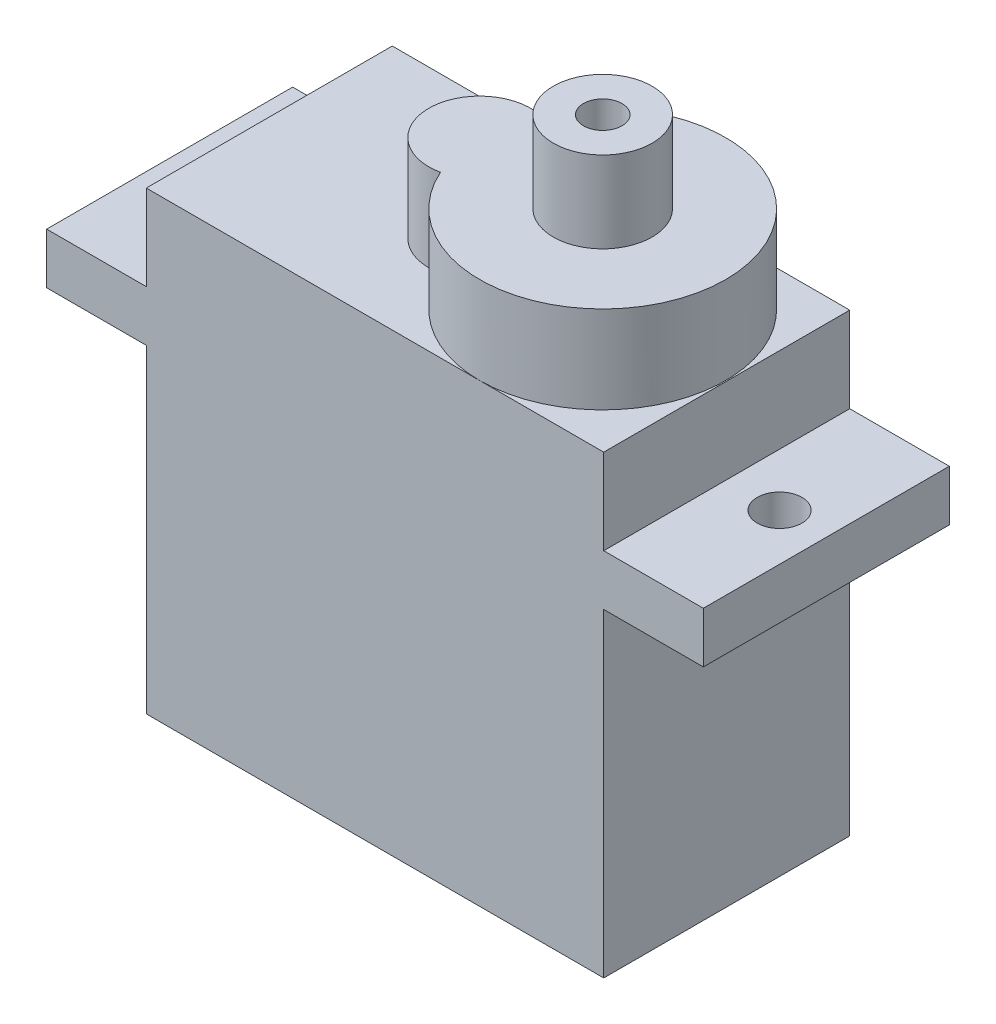
ISO-10303-21;
HEADER;
FILE_DESCRIPTION(('STEP AP214'),'2;1');
FILE_NAME('part.step','',(''),(''),'','','');
FILE_SCHEMA(('AUTOMOTIVE_DESIGN { 1 0 10303 214 1 1 1 1 }'));
ENDSEC;
DATA;
#1=APPLICATION_CONTEXT('core data for automotive mechanical design processes');
#2=APPLICATION_PROTOCOL_DEFINITION('international standard','automotive_design',2000,#1);
#3=PRODUCT_CONTEXT('',#1,'mechanical');
#4=PRODUCT('Part','Part','',(#3));
#5=PRODUCT_RELATED_PRODUCT_CATEGORY('part','',(#4));
#6=PRODUCT_DEFINITION_FORMATION('','',#4);
#7=PRODUCT_DEFINITION_CONTEXT('part definition',#1,'design');
#8=PRODUCT_DEFINITION('design','',#6,#7);
#9=PRODUCT_DEFINITION_SHAPE('','',#8);
#10=(LENGTH_UNIT() NAMED_UNIT(*) SI_UNIT(.MILLI.,.METRE.));
#11=(NAMED_UNIT(*) PLANE_ANGLE_UNIT() SI_UNIT($,.RADIAN.));
#12=(NAMED_UNIT(*) SI_UNIT($,.STERADIAN.) SOLID_ANGLE_UNIT());
#13=UNCERTAINTY_MEASURE_WITH_UNIT(LENGTH_MEASURE(1.E-05),#10,'distance_accuracy_value','');
#14=(GEOMETRIC_REPRESENTATION_CONTEXT(3) GLOBAL_UNCERTAINTY_ASSIGNED_CONTEXT((#13)) GLOBAL_UNIT_ASSIGNED_CONTEXT((#10,
#11,#12)) REPRESENTATION_CONTEXT('',''));
#15=CARTESIAN_POINT('',(0.,0.,0.));
#16=DIRECTION('',(0.,0.,1.));
#17=DIRECTION('',(1.,0.,0.));
#18=AXIS2_PLACEMENT_3D('',#15,#16,#17);
#19=CARTESIAN_POINT('',(2.125,26.7,0.));
#20=DIRECTION('',(0.,1.,0.));
#21=DIRECTION('',(0.,0.,1.));
#22=AXIS2_PLACEMENT_3D('',#19,#20,#21);
#23=PLANE('',#22);
#24=CARTESIAN_POINT('',(-0.900000000000001,26.7,0.));
#25=DIRECTION('',(0.,1.,0.));
#26=DIRECTION('',(0.,0.,1.));
#27=AXIS2_PLACEMENT_3D('',#24,#25,#26);
#28=CIRCLE('',#27,2.5);
#29=CARTESIAN_POINT('',(-0.383471074380167,26.7,-2.44605761767748));
#30=VERTEX_POINT('',#29);
#31=CARTESIAN_POINT('',(-0.383471074380168,26.7,2.44605761767748));
#32=VERTEX_POINT('',#31);
#33=EDGE_CURVE('E149',#30,#32,#28,.T.);
#34=ORIENTED_EDGE('',*,*,#33,.T.);
#35=CARTESIAN_POINT('',(5.15,26.7,0.));
#36=DIRECTION('',(0.,1.,0.));
#37=DIRECTION('',(0.,0.,1.));
#38=AXIS2_PLACEMENT_3D('',#35,#36,#37);
#39=CIRCLE('',#38,6.05);
#40=EDGE_CURVE('E139',#32,#30,#39,.T.);
#41=ORIENTED_EDGE('',*,*,#40,.T.);
#42=EDGE_LOOP('',(#34,#41));
#43=FACE_BOUND('',#42,.T.);
#44=CARTESIAN_POINT('',(5.15,26.7,0.));
#45=DIRECTION('',(0.,1.,0.));
#46=DIRECTION('',(0.,0.,1.));
#47=AXIS2_PLACEMENT_3D('',#44,#45,#46);
#48=CIRCLE('',#47,2.43);
#49=CARTESIAN_POINT('',(5.15,26.7,2.43));
#50=VERTEX_POINT('',#49);
#51=EDGE_CURVE('E396',#50,#50,#48,.T.);
#52=ORIENTED_EDGE('',*,*,#51,.F.);
#53=EDGE_LOOP('',(#52));
#54=FACE_BOUND('',#53,.T.);
#55=ADVANCED_FACE('F33',(#43,#54),#23,.T.);
#56=CARTESIAN_POINT('',(0.,22.4,0.));
#57=DIRECTION('',(0.,1.,0.));
#58=DIRECTION('',(0.,0.,1.));
#59=AXIS2_PLACEMENT_3D('',#56,#57,#58);
#60=PLANE('',#59);
#61=CARTESIAN_POINT('',(-0.900000000000001,22.4,0.));
#62=DIRECTION('',(0.,1.,0.));
#63=DIRECTION('',(0.,0.,1.));
#64=AXIS2_PLACEMENT_3D('',#61,#62,#63);
#65=CIRCLE('',#64,2.5);
#66=CARTESIAN_POINT('',(-0.383471074380167,22.4,-2.44605761767748));
#67=VERTEX_POINT('',#66);
#68=CARTESIAN_POINT('',(-0.383471074380168,22.4,2.44605761767748));
#69=VERTEX_POINT('',#68);
#70=EDGE_CURVE('E155',#67,#69,#65,.T.);
#71=ORIENTED_EDGE('',*,*,#70,.F.);
#72=CARTESIAN_POINT('',(5.15,22.4,0.));
#73=DIRECTION('',(0.,1.,0.));
#74=DIRECTION('',(0.,0.,1.));
#75=AXIS2_PLACEMENT_3D('',#72,#73,#74);
#76=CIRCLE('',#75,6.05);
#77=CARTESIAN_POINT('',(5.15,22.4,-6.05));
#78=VERTEX_POINT('',#77);
#79=EDGE_CURVE('E54',#78,#67,#76,.T.);
#80=ORIENTED_EDGE('',*,*,#79,.F.);
#81=DIRECTION('',(-1.,0.,0.));
#82=VECTOR('',#81,1.);
#83=CARTESIAN_POINT('',(11.25,22.4,-6.05));
#84=LINE('',#83,#82);
#85=CARTESIAN_POINT('',(-11.25,22.4,-6.05));
#86=VERTEX_POINT('',#85);
#87=EDGE_CURVE('E169',#78,#86,#84,.T.);
#88=ORIENTED_EDGE('',*,*,#87,.T.);
#89=DIRECTION('',(0.,0.,1.));
#90=VECTOR('',#89,1.);
#91=CARTESIAN_POINT('',(-11.25,22.4,-6.05));
#92=LINE('',#91,#90);
#93=CARTESIAN_POINT('',(-11.25,22.4,6.05));
#94=VERTEX_POINT('',#93);
#95=EDGE_CURVE('E173',#86,#94,#92,.T.);
#96=ORIENTED_EDGE('',*,*,#95,.T.);
#97=DIRECTION('',(1.,0.,0.));
#98=VECTOR('',#97,1.);
#99=CARTESIAN_POINT('',(-11.25,22.4,6.05));
#100=LINE('',#99,#98);
#101=CARTESIAN_POINT('',(5.15,22.4,6.05));
#102=VERTEX_POINT('',#101);
#103=EDGE_CURVE('E164',#94,#102,#100,.T.);
#104=ORIENTED_EDGE('',*,*,#103,.T.);
#105=EDGE_CURVE('E48',#69,#102,#76,.T.);
#106=ORIENTED_EDGE('',*,*,#105,.F.);
#107=EDGE_LOOP('',(#71,#80,#88,#96,#104,#106));
#108=FACE_BOUND('',#107,.T.);
#109=ADVANCED_FACE('F357',(#108),#60,.T.);
#110=CARTESIAN_POINT('',(0.,18.2,0.));
#111=DIRECTION('',(0.,1.,0.));
#112=DIRECTION('',(0.,0.,1.));
#113=AXIS2_PLACEMENT_3D('',#110,#111,#112);
#114=PLANE('',#113);
#115=DIRECTION('',(0.,0.,1.));
#116=VECTOR('',#115,1.);
#117=CARTESIAN_POINT('',(-11.25,18.2,-6.05));
#118=LINE('',#117,#116);
#119=CARTESIAN_POINT('',(-11.25,18.2,-6.05));
#120=VERTEX_POINT('',#119);
#121=CARTESIAN_POINT('',(-11.25,18.2,6.05));
#122=VERTEX_POINT('',#121);
#123=EDGE_CURVE('E159',#120,#122,#118,.T.);
#124=ORIENTED_EDGE('',*,*,#123,.F.);
#125=DIRECTION('',(-1.,0.,0.));
#126=VECTOR('',#125,1.);
#127=CARTESIAN_POINT('',(16.15,18.2,-6.05));
#128=LINE('',#127,#126);
#129=CARTESIAN_POINT('',(-16.15,18.2,-6.05));
#130=VERTEX_POINT('',#129);
#131=EDGE_CURVE('E182',#120,#130,#128,.T.);
#132=ORIENTED_EDGE('',*,*,#131,.T.);
#133=DIRECTION('',(0.,0.,1.));
#134=VECTOR('',#133,1.);
#135=CARTESIAN_POINT('',(-16.15,18.2,6.05));
#136=LINE('',#135,#134);
#137=CARTESIAN_POINT('',(-16.15,18.2,6.05));
#138=VERTEX_POINT('',#137);
#139=EDGE_CURVE('E238',#130,#138,#136,.T.);
#140=ORIENTED_EDGE('',*,*,#139,.T.);
#141=DIRECTION('',(1.,0.,0.));
#142=VECTOR('',#141,1.);
#143=CARTESIAN_POINT('',(16.15,18.2,6.05));
#144=LINE('',#143,#142);
#145=EDGE_CURVE('E222',#138,#122,#144,.T.);
#146=ORIENTED_EDGE('',*,*,#145,.T.);
#147=EDGE_LOOP('',(#124,#132,#140,#146));
#148=FACE_BOUND('',#147,.T.);
#149=CARTESIAN_POINT('',(-13.85,18.2,0.));
#150=DIRECTION('',(0.,1.,0.));
#151=DIRECTION('',(0.,0.,1.));
#152=AXIS2_PLACEMENT_3D('',#149,#150,#151);
#153=CIRCLE('',#152,1.1);
#154=CARTESIAN_POINT('',(-13.85,18.2,1.1));
#155=VERTEX_POINT('',#154);
#156=EDGE_CURVE('E330',#155,#155,#153,.T.);
#157=ORIENTED_EDGE('',*,*,#156,.F.);
#158=EDGE_LOOP('',(#157));
#159=FACE_BOUND('',#158,.T.);
#160=ADVANCED_FACE('F341',(#148,#159),#114,.T.);
#161=CARTESIAN_POINT('',(-11.25,15.7,6.05));
#162=DIRECTION('',(1.,0.,0.));
#163=DIRECTION('',(0.,0.,-1.));
#164=AXIS2_PLACEMENT_3D('',#161,#162,#163);
#165=PLANE('',#164);
#166=DIRECTION('',(0.,0.,1.));
#167=VECTOR('',#166,1.);
#168=CARTESIAN_POINT('',(-11.25,0.,6.05));
#169=LINE('',#168,#167);
#170=CARTESIAN_POINT('',(-11.25,0.,-6.05));
#171=VERTEX_POINT('',#170);
#172=CARTESIAN_POINT('',(-11.25,0.,6.05));
#173=VERTEX_POINT('',#172);
#174=EDGE_CURVE('E267',#171,#173,#169,.T.);
#175=ORIENTED_EDGE('',*,*,#174,.T.);
#176=DIRECTION('',(0.,-1.,0.));
#177=VECTOR('',#176,1.);
#178=CARTESIAN_POINT('',(-11.25,15.7,6.05));
#179=LINE('',#178,#177);
#180=CARTESIAN_POINT('',(-11.25,15.7,6.05));
#181=VERTEX_POINT('',#180);
#182=EDGE_CURVE('E249',#181,#173,#179,.T.);
#183=ORIENTED_EDGE('',*,*,#182,.F.);
#184=DIRECTION('',(0.,0.,1.));
#185=VECTOR('',#184,1.);
#186=CARTESIAN_POINT('',(-11.25,15.7,6.05));
#187=LINE('',#186,#185);
#188=CARTESIAN_POINT('',(-11.25,15.7,-6.05));
#189=VERTEX_POINT('',#188);
#190=EDGE_CURVE('E253',#189,#181,#187,.T.);
#191=ORIENTED_EDGE('',*,*,#190,.F.);
#192=DIRECTION('',(0.,-1.,0.));
#193=VECTOR('',#192,1.);
#194=CARTESIAN_POINT('',(-11.25,15.7,-6.05));
#195=LINE('',#194,#193);
#196=EDGE_CURVE('E242',#189,#171,#195,.T.);
#197=ORIENTED_EDGE('',*,*,#196,.T.);
#198=EDGE_LOOP('',(#175,#183,#191,#197));
#199=FACE_BOUND('',#198,.T.);
#200=ADVANCED_FACE('F35',(#199),#165,.F.);
#201=CARTESIAN_POINT('',(11.25,15.7,6.05));
#202=DIRECTION('',(0.,0.,-1.));
#203=DIRECTION('',(-1.,0.,0.));
#204=AXIS2_PLACEMENT_3D('',#201,#202,#203);
#205=PLANE('',#204);
#206=DIRECTION('',(1.,0.,0.));
#207=VECTOR('',#206,1.);
#208=CARTESIAN_POINT('',(11.25,0.,6.05));
#209=LINE('',#208,#207);
#210=CARTESIAN_POINT('',(11.25,0.,6.05));
#211=VERTEX_POINT('',#210);
#212=EDGE_CURVE('E284',#173,#211,#209,.T.);
#213=ORIENTED_EDGE('',*,*,#212,.T.);
#214=DIRECTION('',(0.,-1.,0.));
#215=VECTOR('',#214,1.);
#216=CARTESIAN_POINT('',(11.25,15.7,6.05));
#217=LINE('',#216,#215);
#218=CARTESIAN_POINT('',(11.25,15.7,6.05));
#219=VERTEX_POINT('',#218);
#220=EDGE_CURVE('E252',#219,#211,#217,.T.);
#221=ORIENTED_EDGE('',*,*,#220,.F.);
#222=DIRECTION('',(1.,0.,0.));
#223=VECTOR('',#222,1.);
#224=CARTESIAN_POINT('',(16.15,15.7,6.05));
#225=LINE('',#224,#223);
#226=CARTESIAN_POINT('',(16.15,15.7,6.05));
#227=VERTEX_POINT('',#226);
#228=EDGE_CURVE('E263',#219,#227,#225,.T.);
#229=ORIENTED_EDGE('',*,*,#228,.T.);
#230=DIRECTION('',(0.,-1.,0.));
#231=VECTOR('',#230,1.);
#232=CARTESIAN_POINT('',(16.15,18.2,6.05));
#233=LINE('',#232,#231);
#234=CARTESIAN_POINT('',(16.15,18.2,6.05));
#235=VERTEX_POINT('',#234);
#236=EDGE_CURVE('E291',#235,#227,#233,.T.);
#237=ORIENTED_EDGE('',*,*,#236,.F.);
#238=CARTESIAN_POINT('',(11.25,18.2,6.05));
#239=VERTEX_POINT('',#238);
#240=EDGE_CURVE('E227',#239,#235,#144,.T.);
#241=ORIENTED_EDGE('',*,*,#240,.F.);
#242=DIRECTION('',(0.,-1.,0.));
#243=VECTOR('',#242,1.);
#244=CARTESIAN_POINT('',(11.25,22.4,6.05));
#245=LINE('',#244,#243);
#246=CARTESIAN_POINT('',(11.25,22.4,6.05));
#247=VERTEX_POINT('',#246);
#248=EDGE_CURVE('E188',#247,#239,#245,.T.);
#249=ORIENTED_EDGE('',*,*,#248,.F.);
#250=EDGE_CURVE('E167',#102,#247,#100,.T.);
#251=ORIENTED_EDGE('',*,*,#250,.F.);
#252=ORIENTED_EDGE('',*,*,#103,.F.);
#253=DIRECTION('',(0.,-1.,0.));
#254=VECTOR('',#253,1.);
#255=CARTESIAN_POINT('',(-11.25,22.4,6.05));
#256=LINE('',#255,#254);
#257=EDGE_CURVE('E175',#94,#122,#256,.T.);
#258=ORIENTED_EDGE('',*,*,#257,.T.);
#259=ORIENTED_EDGE('',*,*,#145,.F.);
#260=DIRECTION('',(0.,-1.,0.));
#261=VECTOR('',#260,1.);
#262=CARTESIAN_POINT('',(-16.15,18.2,6.05));
#263=LINE('',#262,#261);
#264=CARTESIAN_POINT('',(-16.15,15.7,6.05));
#265=VERTEX_POINT('',#264);
#266=EDGE_CURVE('E287',#138,#265,#263,.T.);
#267=ORIENTED_EDGE('',*,*,#266,.T.);
#268=EDGE_CURVE('E326',#265,#181,#225,.T.);
#269=ORIENTED_EDGE('',*,*,#268,.T.);
#270=ORIENTED_EDGE('',*,*,#182,.T.);
#271=EDGE_LOOP('',(#213,#221,#229,#237,#241,#249,#251,#252,#258,#259,#267,#269,#270));
#272=FACE_BOUND('',#271,.T.);
#273=ADVANCED_FACE('F408',(#272),#205,.F.);
#274=CARTESIAN_POINT('',(11.25,15.7,6.05));
#275=DIRECTION('',(-1.,0.,0.));
#276=DIRECTION('',(0.,0.,1.));
#277=AXIS2_PLACEMENT_3D('',#274,#275,#276);
#278=PLANE('',#277);
#279=DIRECTION('',(0.,0.,-1.));
#280=VECTOR('',#279,1.);
#281=CARTESIAN_POINT('',(11.25,0.,6.05));
#282=LINE('',#281,#280);
#283=CARTESIAN_POINT('',(11.25,0.,-6.05));
#284=VERTEX_POINT('',#283);
#285=EDGE_CURVE('E283',#211,#284,#282,.T.);
#286=ORIENTED_EDGE('',*,*,#285,.T.);
#287=DIRECTION('',(0.,-1.,0.));
#288=VECTOR('',#287,1.);
#289=CARTESIAN_POINT('',(11.25,15.7,-6.05));
#290=LINE('',#289,#288);
#291=CARTESIAN_POINT('',(11.25,15.7,-6.05));
#292=VERTEX_POINT('',#291);
#293=EDGE_CURVE('E245',#292,#284,#290,.T.);
#294=ORIENTED_EDGE('',*,*,#293,.F.);
#295=DIRECTION('',(0.,0.,-1.));
#296=VECTOR('',#295,1.);
#297=CARTESIAN_POINT('',(11.25,15.7,6.05));
#298=LINE('',#297,#296);
#299=EDGE_CURVE('E246',#219,#292,#298,.T.);
#300=ORIENTED_EDGE('',*,*,#299,.F.);
#301=ORIENTED_EDGE('',*,*,#220,.T.);
#302=EDGE_LOOP('',(#286,#294,#300,#301));
#303=FACE_BOUND('',#302,.T.);
#304=ADVANCED_FACE('F318',(#303),#278,.F.);
#305=CARTESIAN_POINT('',(11.25,15.7,-6.05));
#306=DIRECTION('',(0.,0.,1.));
#307=DIRECTION('',(1.,0.,0.));
#308=AXIS2_PLACEMENT_3D('',#305,#306,#307);
#309=PLANE('',#308);
#310=DIRECTION('',(-1.,0.,0.));
#311=VECTOR('',#310,1.);
#312=CARTESIAN_POINT('',(11.25,0.,-6.05));
#313=LINE('',#312,#311);
#314=EDGE_CURVE('E257',#284,#171,#313,.T.);
#315=ORIENTED_EDGE('',*,*,#314,.T.);
#316=ORIENTED_EDGE('',*,*,#196,.F.);
#317=DIRECTION('',(-1.,0.,0.));
#318=VECTOR('',#317,1.);
#319=CARTESIAN_POINT('',(16.15,15.7,-6.05));
#320=LINE('',#319,#318);
#321=CARTESIAN_POINT('',(-16.15,15.7,-6.05));
#322=VERTEX_POINT('',#321);
#323=EDGE_CURVE('E304',#189,#322,#320,.T.);
#324=ORIENTED_EDGE('',*,*,#323,.T.);
#325=DIRECTION('',(0.,-1.,0.));
#326=VECTOR('',#325,1.);
#327=CARTESIAN_POINT('',(-16.15,18.2,-6.05));
#328=LINE('',#327,#326);
#329=EDGE_CURVE('E216',#130,#322,#328,.T.);
#330=ORIENTED_EDGE('',*,*,#329,.F.);
#331=ORIENTED_EDGE('',*,*,#131,.F.);
#332=DIRECTION('',(0.,-1.,0.));
#333=VECTOR('',#332,1.);
#334=CARTESIAN_POINT('',(-11.25,22.4,-6.05));
#335=LINE('',#334,#333);
#336=EDGE_CURVE('E189',#86,#120,#335,.T.);
#337=ORIENTED_EDGE('',*,*,#336,.F.);
#338=ORIENTED_EDGE('',*,*,#87,.F.);
#339=CARTESIAN_POINT('',(11.25,22.4,-6.05));
#340=VERTEX_POINT('',#339);
#341=EDGE_CURVE('E170',#340,#78,#84,.T.);
#342=ORIENTED_EDGE('',*,*,#341,.F.);
#343=DIRECTION('',(0.,-1.,0.));
#344=VECTOR('',#343,1.);
#345=CARTESIAN_POINT('',(11.25,22.4,-6.05));
#346=LINE('',#345,#344);
#347=CARTESIAN_POINT('',(11.25,18.2,-6.05));
#348=VERTEX_POINT('',#347);
#349=EDGE_CURVE('E185',#340,#348,#346,.T.);
#350=ORIENTED_EDGE('',*,*,#349,.T.);
#351=CARTESIAN_POINT('',(16.15,18.2,-6.05));
#352=VERTEX_POINT('',#351);
#353=EDGE_CURVE('E220',#352,#348,#128,.T.);
#354=ORIENTED_EDGE('',*,*,#353,.F.);
#355=DIRECTION('',(0.,-1.,0.));
#356=VECTOR('',#355,1.);
#357=CARTESIAN_POINT('',(16.15,18.2,-6.05));
#358=LINE('',#357,#356);
#359=CARTESIAN_POINT('',(16.15,15.7,-6.05));
#360=VERTEX_POINT('',#359);
#361=EDGE_CURVE('E297',#352,#360,#358,.T.);
#362=ORIENTED_EDGE('',*,*,#361,.T.);
#363=EDGE_CURVE('E301',#360,#292,#320,.T.);
#364=ORIENTED_EDGE('',*,*,#363,.T.);
#365=ORIENTED_EDGE('',*,*,#293,.T.);
#366=EDGE_LOOP('',(#315,#316,#324,#330,#331,#337,#338,#342,#350,#354,#362,#364,#365));
#367=FACE_BOUND('',#366,.T.);
#368=ADVANCED_FACE('F212',(#367),#309,.F.);
#369=CARTESIAN_POINT('',(0.,0.,0.));
#370=DIRECTION('',(0.,1.,0.));
#371=DIRECTION('',(0.,0.,1.));
#372=AXIS2_PLACEMENT_3D('',#369,#370,#371);
#373=PLANE('',#372);
#374=ORIENTED_EDGE('',*,*,#174,.F.);
#375=ORIENTED_EDGE('',*,*,#314,.F.);
#376=ORIENTED_EDGE('',*,*,#285,.F.);
#377=ORIENTED_EDGE('',*,*,#212,.F.);
#378=EDGE_LOOP('',(#374,#375,#376,#377));
#379=FACE_BOUND('',#378,.T.);
#380=ADVANCED_FACE('F320',(#379),#373,.F.);
#381=CARTESIAN_POINT('',(0.,15.7,0.));
#382=DIRECTION('',(0.,1.,0.));
#383=DIRECTION('',(0.,0.,1.));
#384=AXIS2_PLACEMENT_3D('',#381,#382,#383);
#385=PLANE('',#384);
#386=CARTESIAN_POINT('',(-13.85,15.7,0.));
#387=DIRECTION('',(0.,1.,0.));
#388=DIRECTION('',(0.,0.,1.));
#389=AXIS2_PLACEMENT_3D('',#386,#387,#388);
#390=CIRCLE('',#389,1.1);
#391=CARTESIAN_POINT('',(-13.85,15.7,1.1));
#392=VERTEX_POINT('',#391);
#393=EDGE_CURVE('E333',#392,#392,#390,.T.);
#394=ORIENTED_EDGE('',*,*,#393,.T.);
#395=EDGE_LOOP('',(#394));
#396=FACE_BOUND('',#395,.T.);
#397=ORIENTED_EDGE('',*,*,#323,.F.);
#398=ORIENTED_EDGE('',*,*,#190,.T.);
#399=ORIENTED_EDGE('',*,*,#268,.F.);
#400=DIRECTION('',(0.,0.,1.));
#401=VECTOR('',#400,1.);
#402=CARTESIAN_POINT('',(-16.15,15.7,6.05));
#403=LINE('',#402,#401);
#404=EDGE_CURVE('E234',#322,#265,#403,.T.);
#405=ORIENTED_EDGE('',*,*,#404,.F.);
#406=EDGE_LOOP('',(#397,#398,#399,#405));
#407=FACE_BOUND('',#406,.T.);
#408=ADVANCED_FACE('F325',(#396,#407),#385,.F.);
#409=CARTESIAN_POINT('',(13.85,15.7,0.));
#410=DIRECTION('',(0.,1.,0.));
#411=DIRECTION('',(0.,0.,1.));
#412=AXIS2_PLACEMENT_3D('',#409,#410,#411);
#413=CIRCLE('',#412,1.1);
#414=CARTESIAN_POINT('',(13.85,15.7,1.1));
#415=VERTEX_POINT('',#414);
#416=EDGE_CURVE('E194',#415,#415,#413,.T.);
#417=ORIENTED_EDGE('',*,*,#416,.T.);
#418=EDGE_LOOP('',(#417));
#419=FACE_BOUND('',#418,.T.);
#420=ORIENTED_EDGE('',*,*,#228,.F.);
#421=ORIENTED_EDGE('',*,*,#299,.T.);
#422=ORIENTED_EDGE('',*,*,#363,.F.);
#423=DIRECTION('',(0.,0.,-1.));
#424=VECTOR('',#423,1.);
#425=CARTESIAN_POINT('',(16.15,15.7,6.05));
#426=LINE('',#425,#424);
#427=EDGE_CURVE('E308',#227,#360,#426,.T.);
#428=ORIENTED_EDGE('',*,*,#427,.F.);
#429=EDGE_LOOP('',(#420,#421,#422,#428));
#430=FACE_BOUND('',#429,.T.);
#431=ADVANCED_FACE('F317',(#419,#430),#385,.F.);
#432=DIRECTION('',(0.,0.,-1.));
#433=VECTOR('',#432,1.);
#434=CARTESIAN_POINT('',(11.25,18.2,6.05));
#435=LINE('',#434,#433);
#436=EDGE_CURVE('E156',#239,#348,#435,.T.);
#437=ORIENTED_EDGE('',*,*,#436,.F.);
#438=ORIENTED_EDGE('',*,*,#240,.T.);
#439=DIRECTION('',(0.,0.,-1.));
#440=VECTOR('',#439,1.);
#441=CARTESIAN_POINT('',(16.15,18.2,6.05));
#442=LINE('',#441,#440);
#443=EDGE_CURVE('E221',#235,#352,#442,.T.);
#444=ORIENTED_EDGE('',*,*,#443,.T.);
#445=ORIENTED_EDGE('',*,*,#353,.T.);
#446=EDGE_LOOP('',(#437,#438,#444,#445));
#447=FACE_BOUND('',#446,.T.);
#448=CARTESIAN_POINT('',(13.85,18.2,0.));
#449=DIRECTION('',(0.,1.,0.));
#450=DIRECTION('',(0.,0.,1.));
#451=AXIS2_PLACEMENT_3D('',#448,#449,#450);
#452=CIRCLE('',#451,1.1);
#453=CARTESIAN_POINT('',(13.85,18.2,1.1));
#454=VERTEX_POINT('',#453);
#455=EDGE_CURVE('E338',#454,#454,#452,.T.);
#456=ORIENTED_EDGE('',*,*,#455,.F.);
#457=EDGE_LOOP('',(#456));
#458=FACE_BOUND('',#457,.T.);
#459=ADVANCED_FACE('F346',(#447,#458),#114,.T.);
#460=CARTESIAN_POINT('',(-16.15,18.2,6.05));
#461=DIRECTION('',(1.,0.,0.));
#462=DIRECTION('',(0.,0.,-1.));
#463=AXIS2_PLACEMENT_3D('',#460,#461,#462);
#464=PLANE('',#463);
#465=ORIENTED_EDGE('',*,*,#404,.T.);
#466=ORIENTED_EDGE('',*,*,#266,.F.);
#467=ORIENTED_EDGE('',*,*,#139,.F.);
#468=ORIENTED_EDGE('',*,*,#329,.T.);
#469=EDGE_LOOP('',(#465,#466,#467,#468));
#470=FACE_BOUND('',#469,.T.);
#471=ADVANCED_FACE('F343',(#470),#464,.F.);
#472=CARTESIAN_POINT('',(16.15,18.2,6.05));
#473=DIRECTION('',(-1.,0.,0.));
#474=DIRECTION('',(0.,0.,1.));
#475=AXIS2_PLACEMENT_3D('',#472,#473,#474);
#476=PLANE('',#475);
#477=ORIENTED_EDGE('',*,*,#427,.T.);
#478=ORIENTED_EDGE('',*,*,#361,.F.);
#479=ORIENTED_EDGE('',*,*,#443,.F.);
#480=ORIENTED_EDGE('',*,*,#236,.T.);
#481=EDGE_LOOP('',(#477,#478,#479,#480));
#482=FACE_BOUND('',#481,.T.);
#483=ADVANCED_FACE('F345',(#482),#476,.F.);
#484=CARTESIAN_POINT('',(-13.85,18.2,0.));
#485=DIRECTION('',(0.,-1.,0.));
#486=DIRECTION('',(0.,0.,-1.));
#487=AXIS2_PLACEMENT_3D('',#484,#485,#486);
#488=CYLINDRICAL_SURFACE('',#487,1.1);
#489=ORIENTED_EDGE('',*,*,#156,.T.);
#490=EDGE_LOOP('',(#489));
#491=FACE_BOUND('',#490,.T.);
#492=ORIENTED_EDGE('',*,*,#393,.F.);
#493=EDGE_LOOP('',(#492));
#494=FACE_BOUND('',#493,.T.);
#495=ADVANCED_FACE('F352',(#491,#494),#488,.F.);
#496=CARTESIAN_POINT('',(13.85,18.2,0.));
#497=DIRECTION('',(0.,-1.,0.));
#498=DIRECTION('',(0.,0.,-1.));
#499=AXIS2_PLACEMENT_3D('',#496,#497,#498);
#500=CYLINDRICAL_SURFACE('',#499,1.1);
#501=ORIENTED_EDGE('',*,*,#455,.T.);
#502=EDGE_LOOP('',(#501));
#503=FACE_BOUND('',#502,.T.);
#504=ORIENTED_EDGE('',*,*,#416,.F.);
#505=EDGE_LOOP('',(#504));
#506=FACE_BOUND('',#505,.T.);
#507=ADVANCED_FACE('F421',(#503,#506),#500,.F.);
#508=CARTESIAN_POINT('',(11.25,22.4,6.05));
#509=DIRECTION('',(-1.,0.,0.));
#510=DIRECTION('',(0.,0.,1.));
#511=AXIS2_PLACEMENT_3D('',#508,#509,#510);
#512=PLANE('',#511);
#513=ORIENTED_EDGE('',*,*,#436,.T.);
#514=ORIENTED_EDGE('',*,*,#349,.F.);
#515=DIRECTION('',(0.,0.,-1.));
#516=VECTOR('',#515,1.);
#517=CARTESIAN_POINT('',(11.25,22.4,6.05));
#518=LINE('',#517,#516);
#519=EDGE_CURVE('E166',#247,#340,#518,.T.);
#520=ORIENTED_EDGE('',*,*,#519,.F.);
#521=ORIENTED_EDGE('',*,*,#248,.T.);
#522=EDGE_LOOP('',(#513,#514,#520,#521));
#523=FACE_BOUND('',#522,.T.);
#524=ADVANCED_FACE('F411',(#523),#512,.F.);
#525=CARTESIAN_POINT('',(-11.25,22.4,-6.05));
#526=DIRECTION('',(1.,0.,0.));
#527=DIRECTION('',(0.,0.,-1.));
#528=AXIS2_PLACEMENT_3D('',#525,#526,#527);
#529=PLANE('',#528);
#530=ORIENTED_EDGE('',*,*,#123,.T.);
#531=ORIENTED_EDGE('',*,*,#257,.F.);
#532=ORIENTED_EDGE('',*,*,#95,.F.);
#533=ORIENTED_EDGE('',*,*,#336,.T.);
#534=EDGE_LOOP('',(#530,#531,#532,#533));
#535=FACE_BOUND('',#534,.T.);
#536=ADVANCED_FACE('F208',(#535),#529,.F.);
#537=EDGE_CURVE('E41',#102,#78,#76,.T.);
#538=ORIENTED_EDGE('',*,*,#537,.F.);
#539=ORIENTED_EDGE('',*,*,#250,.T.);
#540=ORIENTED_EDGE('',*,*,#519,.T.);
#541=ORIENTED_EDGE('',*,*,#341,.T.);
#542=EDGE_LOOP('',(#538,#539,#540,#541));
#543=FACE_BOUND('',#542,.T.);
#544=ADVANCED_FACE('F364',(#543),#60,.T.);
#545=CARTESIAN_POINT('',(-0.900000000000001,26.7,0.));
#546=DIRECTION('',(0.,-1.,0.));
#547=DIRECTION('',(0.,0.,-1.));
#548=AXIS2_PLACEMENT_3D('',#545,#546,#547);
#549=CYLINDRICAL_SURFACE('',#548,2.5);
#550=ORIENTED_EDGE('',*,*,#70,.T.);
#551=DIRECTION('',(0.,-1.,0.));
#552=VECTOR('',#551,1.);
#553=CARTESIAN_POINT('',(-0.383471074380168,26.7,2.44605761767748));
#554=LINE('',#553,#552);
#555=EDGE_CURVE('E143',#32,#69,#554,.T.);
#556=ORIENTED_EDGE('',*,*,#555,.F.);
#557=ORIENTED_EDGE('',*,*,#33,.F.);
#558=DIRECTION('',(0.,-1.,0.));
#559=VECTOR('',#558,1.);
#560=CARTESIAN_POINT('',(-0.383471074380167,26.7,-2.44605761767748));
#561=LINE('',#560,#559);
#562=EDGE_CURVE('E146',#30,#67,#561,.T.);
#563=ORIENTED_EDGE('',*,*,#562,.T.);
#564=EDGE_LOOP('',(#550,#556,#557,#563));
#565=FACE_BOUND('',#564,.T.);
#566=ADVANCED_FACE('F154',(#565),#549,.T.);
#567=CARTESIAN_POINT('',(5.15,26.7,0.));
#568=DIRECTION('',(0.,-1.,0.));
#569=DIRECTION('',(0.,0.,-1.));
#570=AXIS2_PLACEMENT_3D('',#567,#568,#569);
#571=CYLINDRICAL_SURFACE('',#570,6.05);
#572=ORIENTED_EDGE('',*,*,#105,.T.);
#573=ORIENTED_EDGE('',*,*,#537,.T.);
#574=ORIENTED_EDGE('',*,*,#79,.T.);
#575=ORIENTED_EDGE('',*,*,#562,.F.);
#576=ORIENTED_EDGE('',*,*,#40,.F.);
#577=ORIENTED_EDGE('',*,*,#555,.T.);
#578=EDGE_LOOP('',(#572,#573,#574,#575,#576,#577));
#579=FACE_BOUND('',#578,.T.);
#580=ADVANCED_FACE('F141',(#579),#571,.T.);
#581=CARTESIAN_POINT('',(5.15,30.7,0.));
#582=DIRECTION('',(0.,1.,0.));
#583=DIRECTION('',(0.,0.,1.));
#584=AXIS2_PLACEMENT_3D('',#581,#582,#583);
#585=PLANE('',#584);
#586=CARTESIAN_POINT('',(5.15,30.7,0.));
#587=DIRECTION('',(0.,1.,0.));
#588=DIRECTION('',(0.,0.,1.));
#589=AXIS2_PLACEMENT_3D('',#586,#587,#588);
#590=CIRCLE('',#589,2.43);
#591=CARTESIAN_POINT('',(5.15,30.7,2.43));
#592=VERTEX_POINT('',#591);
#593=EDGE_CURVE('E393',#592,#592,#590,.T.);
#594=ORIENTED_EDGE('',*,*,#593,.T.);
#595=EDGE_LOOP('',(#594));
#596=FACE_BOUND('',#595,.T.);
#597=CARTESIAN_POINT('',(5.15,30.7,0.));
#598=DIRECTION('',(0.,1.,0.));
#599=DIRECTION('',(0.,0.,1.));
#600=AXIS2_PLACEMENT_3D('',#597,#598,#599);
#601=CIRCLE('',#600,0.95);
#602=CARTESIAN_POINT('',(5.15,30.7,0.95));
#603=VERTEX_POINT('',#602);
#604=EDGE_CURVE('E395',#603,#603,#601,.T.);
#605=ORIENTED_EDGE('',*,*,#604,.F.);
#606=EDGE_LOOP('',(#605));
#607=FACE_BOUND('',#606,.T.);
#608=ADVANCED_FACE('F381',(#596,#607),#585,.T.);
#609=CARTESIAN_POINT('',(5.15,30.7,0.));
#610=DIRECTION('',(0.,-1.,0.));
#611=DIRECTION('',(0.,0.,-1.));
#612=AXIS2_PLACEMENT_3D('',#609,#610,#611);
#613=CYLINDRICAL_SURFACE('',#612,2.43);
#614=ORIENTED_EDGE('',*,*,#593,.F.);
#615=EDGE_LOOP('',(#614));
#616=FACE_BOUND('',#615,.T.);
#617=ORIENTED_EDGE('',*,*,#51,.T.);
#618=EDGE_LOOP('',(#617));
#619=FACE_BOUND('',#618,.T.);
#620=ADVANCED_FACE('F373',(#616,#619),#613,.T.);
#621=CARTESIAN_POINT('',(5.15,30.7,0.));
#622=DIRECTION('',(0.,-1.,0.));
#623=DIRECTION('',(0.,0.,-1.));
#624=AXIS2_PLACEMENT_3D('',#621,#622,#623);
#625=CYLINDRICAL_SURFACE('',#624,0.95);
#626=ORIENTED_EDGE('',*,*,#604,.T.);
#627=EDGE_LOOP('',(#626));
#628=FACE_BOUND('',#627,.T.);
#629=CARTESIAN_POINT('',(5.15,26.7,0.));
#630=DIRECTION('',(0.,1.,0.));
#631=DIRECTION('',(0.,0.,1.));
#632=AXIS2_PLACEMENT_3D('',#629,#630,#631);
#633=CIRCLE('',#632,0.95);
#634=CARTESIAN_POINT('',(5.15,26.7,0.95));
#635=VERTEX_POINT('',#634);
#636=EDGE_CURVE('E11',#635,#635,#633,.F.);
#637=ORIENTED_EDGE('',*,*,#636,.T.);
#638=EDGE_LOOP('',(#637));
#639=FACE_BOUND('',#638,.T.);
#640=ADVANCED_FACE('F368',(#628,#639),#625,.F.);
#641=ORIENTED_EDGE('',*,*,#636,.F.);
#642=EDGE_LOOP('',(#641));
#643=FACE_BOUND('',#642,.T.);
#644=ADVANCED_FACE('F359',(#643),#23,.T.);
#645=CLOSED_SHELL('',(#55,#109,#160,#200,#273,#304,#368,#380,#408,#431,#459,#471,#483,#495,#507,
#524,#536,#544,#566,#580,#608,#620,#640,#644));
#646=MANIFOLD_SOLID_BREP('B2',#645);
#647=ADVANCED_BREP_SHAPE_REPRESENTATION('',(#18,#646),#14);
#648=SHAPE_DEFINITION_REPRESENTATION(#9,#647);
ENDSEC;
END-ISO-10303-21;
